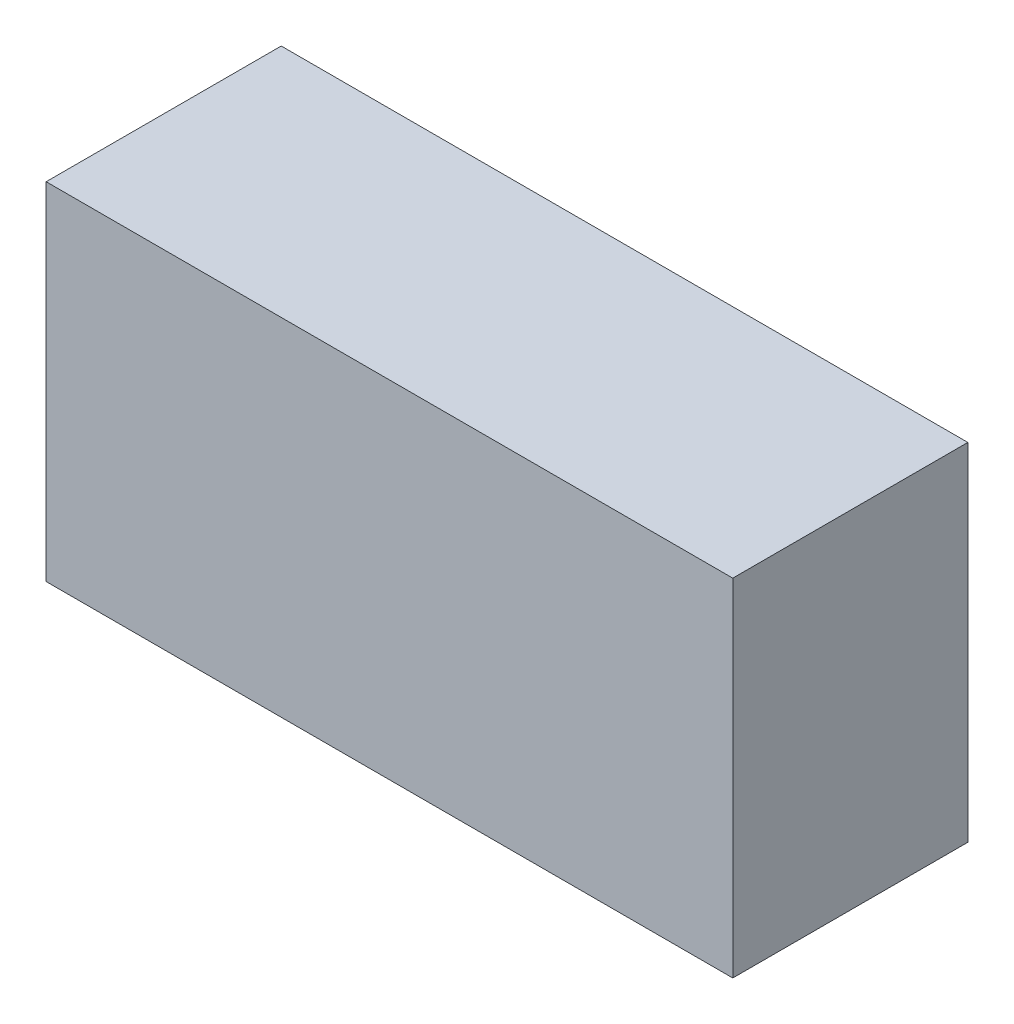
ISO-10303-21;
HEADER;
FILE_DESCRIPTION(('STEP AP214'),'2;1');
FILE_NAME('part.step','',(''),(''),'','','');
FILE_SCHEMA(('AUTOMOTIVE_DESIGN { 1 0 10303 214 1 1 1 1 }'));
ENDSEC;
DATA;
#1=APPLICATION_CONTEXT('core data for automotive mechanical design processes');
#2=APPLICATION_PROTOCOL_DEFINITION('international standard','automotive_design',2000,#1);
#3=PRODUCT_CONTEXT('',#1,'mechanical');
#4=PRODUCT('Part','Part','',(#3));
#5=PRODUCT_RELATED_PRODUCT_CATEGORY('part','',(#4));
#6=PRODUCT_DEFINITION_FORMATION('','',#4);
#7=PRODUCT_DEFINITION_CONTEXT('part definition',#1,'design');
#8=PRODUCT_DEFINITION('design','',#6,#7);
#9=PRODUCT_DEFINITION_SHAPE('','',#8);
#10=(LENGTH_UNIT() NAMED_UNIT(*) SI_UNIT(.MILLI.,.METRE.));
#11=(NAMED_UNIT(*) PLANE_ANGLE_UNIT() SI_UNIT($,.RADIAN.));
#12=(NAMED_UNIT(*) SI_UNIT($,.STERADIAN.) SOLID_ANGLE_UNIT());
#13=UNCERTAINTY_MEASURE_WITH_UNIT(LENGTH_MEASURE(1.E-05),#10,'distance_accuracy_value','');
#14=(GEOMETRIC_REPRESENTATION_CONTEXT(3) GLOBAL_UNCERTAINTY_ASSIGNED_CONTEXT((#13)) GLOBAL_UNIT_ASSIGNED_CONTEXT((#10,
#11,#12)) REPRESENTATION_CONTEXT('',''));
#15=CARTESIAN_POINT('',(0.,0.,0.));
#16=DIRECTION('',(0.,0.,1.));
#17=DIRECTION('',(1.,0.,0.));
#18=AXIS2_PLACEMENT_3D('',#15,#16,#17);
#19=CARTESIAN_POINT('',(-1.4224,-0.7366,1.));
#20=DIRECTION('',(1.,0.,0.));
#21=DIRECTION('',(0.,0.,-1.));
#22=AXIS2_PLACEMENT_3D('',#19,#20,#21);
#23=PLANE('',#22);
#24=DIRECTION('',(0.,-1.,0.));
#25=VECTOR('',#24,1.);
#26=CARTESIAN_POINT('',(-1.4224,-0.7366,0.));
#27=LINE('',#26,#25);
#28=CARTESIAN_POINT('',(-1.4224,0.7366,0.));
#29=VERTEX_POINT('',#28);
#30=CARTESIAN_POINT('',(-1.4224,-0.7366,0.));
#31=VERTEX_POINT('',#30);
#32=EDGE_CURVE('E95',#29,#31,#27,.T.);
#33=ORIENTED_EDGE('',*,*,#32,.T.);
#34=DIRECTION('',(0.,0.,-1.));
#35=VECTOR('',#34,1.);
#36=CARTESIAN_POINT('',(-1.4224,-0.7366,1.));
#37=LINE('',#36,#35);
#38=CARTESIAN_POINT('',(-1.4224,-0.7366,1.));
#39=VERTEX_POINT('',#38);
#40=EDGE_CURVE('E11',#39,#31,#37,.T.);
#41=ORIENTED_EDGE('',*,*,#40,.F.);
#42=DIRECTION('',(0.,-1.,0.));
#43=VECTOR('',#42,1.);
#44=CARTESIAN_POINT('',(-1.4224,-0.7366,1.));
#45=LINE('',#44,#43);
#46=CARTESIAN_POINT('',(-1.4224,0.7366,1.));
#47=VERTEX_POINT('',#46);
#48=EDGE_CURVE('E83',#47,#39,#45,.T.);
#49=ORIENTED_EDGE('',*,*,#48,.F.);
#50=DIRECTION('',(0.,0.,-1.));
#51=VECTOR('',#50,1.);
#52=CARTESIAN_POINT('',(-1.4224,0.7366,1.));
#53=LINE('',#52,#51);
#54=EDGE_CURVE('E91',#47,#29,#53,.T.);
#55=ORIENTED_EDGE('',*,*,#54,.T.);
#56=EDGE_LOOP('',(#33,#41,#49,#55));
#57=FACE_BOUND('',#56,.T.);
#58=ADVANCED_FACE('F32',(#57),#23,.F.);
#59=CARTESIAN_POINT('',(1.4986,-0.7366,1.));
#60=DIRECTION('',(0.,1.,0.));
#61=DIRECTION('',(0.,0.,1.));
#62=AXIS2_PLACEMENT_3D('',#59,#60,#61);
#63=PLANE('',#62);
#64=DIRECTION('',(1.,0.,0.));
#65=VECTOR('',#64,1.);
#66=CARTESIAN_POINT('',(1.4986,-0.7366,0.));
#67=LINE('',#66,#65);
#68=CARTESIAN_POINT('',(1.4986,-0.7366,0.));
#69=VERTEX_POINT('',#68);
#70=EDGE_CURVE('E87',#31,#69,#67,.T.);
#71=ORIENTED_EDGE('',*,*,#70,.T.);
#72=DIRECTION('',(0.,0.,-1.));
#73=VECTOR('',#72,1.);
#74=CARTESIAN_POINT('',(1.4986,-0.7366,1.));
#75=LINE('',#74,#73);
#76=CARTESIAN_POINT('',(1.4986,-0.7366,1.));
#77=VERTEX_POINT('',#76);
#78=EDGE_CURVE('E40',#77,#69,#75,.T.);
#79=ORIENTED_EDGE('',*,*,#78,.F.);
#80=DIRECTION('',(1.,0.,0.));
#81=VECTOR('',#80,1.);
#82=CARTESIAN_POINT('',(1.4986,-0.7366,1.));
#83=LINE('',#82,#81);
#84=EDGE_CURVE('E78',#39,#77,#83,.T.);
#85=ORIENTED_EDGE('',*,*,#84,.F.);
#86=ORIENTED_EDGE('',*,*,#40,.T.);
#87=EDGE_LOOP('',(#71,#79,#85,#86));
#88=FACE_BOUND('',#87,.T.);
#89=ADVANCED_FACE('F86',(#88),#63,.F.);
#90=CARTESIAN_POINT('',(1.4986,0.7366,1.));
#91=DIRECTION('',(-1.,0.,0.));
#92=DIRECTION('',(0.,0.,1.));
#93=AXIS2_PLACEMENT_3D('',#90,#91,#92);
#94=PLANE('',#93);
#95=DIRECTION('',(0.,1.,0.));
#96=VECTOR('',#95,1.);
#97=CARTESIAN_POINT('',(1.4986,0.7366,0.));
#98=LINE('',#97,#96);
#99=CARTESIAN_POINT('',(1.4986,0.7366,0.));
#100=VERTEX_POINT('',#99);
#101=EDGE_CURVE('E65',#69,#100,#98,.T.);
#102=ORIENTED_EDGE('',*,*,#101,.T.);
#103=DIRECTION('',(0.,0.,-1.));
#104=VECTOR('',#103,1.);
#105=CARTESIAN_POINT('',(1.4986,0.7366,1.));
#106=LINE('',#105,#104);
#107=CARTESIAN_POINT('',(1.4986,0.7366,1.));
#108=VERTEX_POINT('',#107);
#109=EDGE_CURVE('E88',#108,#100,#106,.T.);
#110=ORIENTED_EDGE('',*,*,#109,.F.);
#111=DIRECTION('',(0.,1.,0.));
#112=VECTOR('',#111,1.);
#113=CARTESIAN_POINT('',(1.4986,0.7366,1.));
#114=LINE('',#113,#112);
#115=EDGE_CURVE('E81',#77,#108,#114,.T.);
#116=ORIENTED_EDGE('',*,*,#115,.F.);
#117=ORIENTED_EDGE('',*,*,#78,.T.);
#118=EDGE_LOOP('',(#102,#110,#116,#117));
#119=FACE_BOUND('',#118,.T.);
#120=ADVANCED_FACE('F89',(#119),#94,.F.);
#121=CARTESIAN_POINT('',(-1.4224,0.7366,1.));
#122=DIRECTION('',(0.,-1.,0.));
#123=DIRECTION('',(0.,0.,-1.));
#124=AXIS2_PLACEMENT_3D('',#121,#122,#123);
#125=PLANE('',#124);
#126=DIRECTION('',(-1.,0.,0.));
#127=VECTOR('',#126,1.);
#128=CARTESIAN_POINT('',(-1.4224,0.7366,0.));
#129=LINE('',#128,#127);
#130=EDGE_CURVE('E71',#100,#29,#129,.T.);
#131=ORIENTED_EDGE('',*,*,#130,.T.);
#132=ORIENTED_EDGE('',*,*,#54,.F.);
#133=DIRECTION('',(-1.,0.,0.));
#134=VECTOR('',#133,1.);
#135=CARTESIAN_POINT('',(-1.4224,0.7366,1.));
#136=LINE('',#135,#134);
#137=EDGE_CURVE('E48',#108,#47,#136,.T.);
#138=ORIENTED_EDGE('',*,*,#137,.F.);
#139=ORIENTED_EDGE('',*,*,#109,.T.);
#140=EDGE_LOOP('',(#131,#132,#138,#139));
#141=FACE_BOUND('',#140,.T.);
#142=ADVANCED_FACE('F102',(#141),#125,.F.);
#143=CARTESIAN_POINT('',(0.,0.,1.));
#144=DIRECTION('',(0.,0.,-1.));
#145=DIRECTION('',(-1.,0.,0.));
#146=AXIS2_PLACEMENT_3D('',#143,#144,#145);
#147=PLANE('',#146);
#148=ORIENTED_EDGE('',*,*,#48,.T.);
#149=ORIENTED_EDGE('',*,*,#84,.T.);
#150=ORIENTED_EDGE('',*,*,#115,.T.);
#151=ORIENTED_EDGE('',*,*,#137,.T.);
#152=EDGE_LOOP('',(#148,#149,#150,#151));
#153=FACE_BOUND('',#152,.T.);
#154=ADVANCED_FACE('F79',(#153),#147,.F.);
#155=CARTESIAN_POINT('',(0.,0.,0.));
#156=DIRECTION('',(0.,0.,-1.));
#157=DIRECTION('',(-1.,0.,0.));
#158=AXIS2_PLACEMENT_3D('',#155,#156,#157);
#159=PLANE('',#158);
#160=ORIENTED_EDGE('',*,*,#32,.F.);
#161=ORIENTED_EDGE('',*,*,#130,.F.);
#162=ORIENTED_EDGE('',*,*,#101,.F.);
#163=ORIENTED_EDGE('',*,*,#70,.F.);
#164=EDGE_LOOP('',(#160,#161,#162,#163));
#165=FACE_BOUND('',#164,.T.);
#166=ADVANCED_FACE('F105',(#165),#159,.T.);
#167=CLOSED_SHELL('',(#58,#89,#120,#142,#154,#166));
#168=MANIFOLD_SOLID_BREP('B2',#167);
#169=ADVANCED_BREP_SHAPE_REPRESENTATION('',(#18,#168),#14);
#170=SHAPE_DEFINITION_REPRESENTATION(#9,#169);
ENDSEC;
END-ISO-10303-21;
